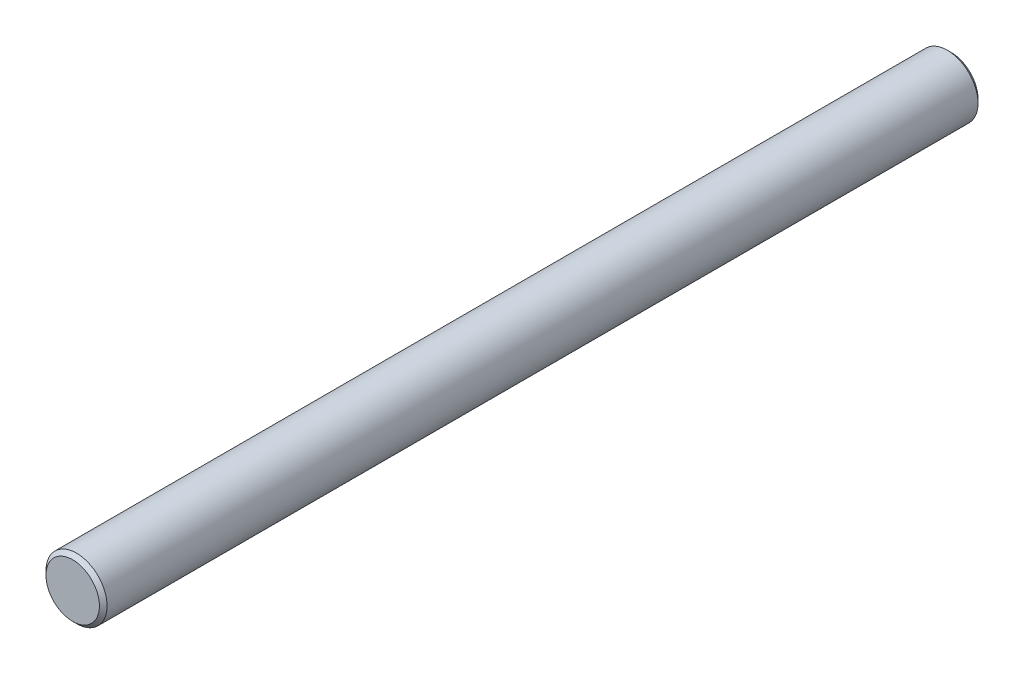
ISO-10303-21;
HEADER;
FILE_DESCRIPTION(('STEP AP214'),'2;1');
FILE_NAME('part.step','',(''),(''),'','','');
FILE_SCHEMA(('AUTOMOTIVE_DESIGN { 1 0 10303 214 1 1 1 1 }'));
ENDSEC;
DATA;
#1=APPLICATION_CONTEXT('core data for automotive mechanical design processes');
#2=APPLICATION_PROTOCOL_DEFINITION('international standard','automotive_design',2000,#1);
#3=PRODUCT_CONTEXT('',#1,'mechanical');
#4=PRODUCT('Part','Part','',(#3));
#5=PRODUCT_RELATED_PRODUCT_CATEGORY('part','',(#4));
#6=PRODUCT_DEFINITION_FORMATION('','',#4);
#7=PRODUCT_DEFINITION_CONTEXT('part definition',#1,'design');
#8=PRODUCT_DEFINITION('design','',#6,#7);
#9=PRODUCT_DEFINITION_SHAPE('','',#8);
#10=(LENGTH_UNIT() NAMED_UNIT(*) SI_UNIT(.MILLI.,.METRE.));
#11=(NAMED_UNIT(*) PLANE_ANGLE_UNIT() SI_UNIT($,.RADIAN.));
#12=(NAMED_UNIT(*) SI_UNIT($,.STERADIAN.) SOLID_ANGLE_UNIT());
#13=UNCERTAINTY_MEASURE_WITH_UNIT(LENGTH_MEASURE(1.E-05),#10,'distance_accuracy_value','');
#14=(GEOMETRIC_REPRESENTATION_CONTEXT(3) GLOBAL_UNCERTAINTY_ASSIGNED_CONTEXT((#13)) GLOBAL_UNIT_ASSIGNED_CONTEXT((#10,
#11,#12)) REPRESENTATION_CONTEXT('',''));
#15=CARTESIAN_POINT('',(0.,0.,0.));
#16=DIRECTION('',(0.,0.,1.));
#17=DIRECTION('',(1.,0.,0.));
#18=AXIS2_PLACEMENT_3D('',#15,#16,#17);
#19=CARTESIAN_POINT('',(0.,0.,57.5));
#20=DIRECTION('',(0.,0.,-1.));
#21=DIRECTION('',(-1.,0.,0.));
#22=AXIS2_PLACEMENT_3D('',#19,#20,#21);
#23=CYLINDRICAL_SURFACE('',#22,4.);
#24=CARTESIAN_POINT('',(0.,0.,-57.));
#25=DIRECTION('',(0.,0.,1.));
#26=DIRECTION('',(1.,0.,0.));
#27=AXIS2_PLACEMENT_3D('',#24,#25,#26);
#28=CIRCLE('',#27,4.);
#29=CARTESIAN_POINT('',(4.,0.,-57.));
#30=VERTEX_POINT('',#29);
#31=EDGE_CURVE('E51',#30,#30,#28,.T.);
#32=ORIENTED_EDGE('',*,*,#31,.T.);
#33=EDGE_LOOP('',(#32));
#34=FACE_BOUND('',#33,.T.);
#35=CARTESIAN_POINT('',(0.,0.,57.));
#36=DIRECTION('',(0.,0.,1.));
#37=DIRECTION('',(1.,0.,0.));
#38=AXIS2_PLACEMENT_3D('',#35,#36,#37);
#39=CIRCLE('',#38,4.);
#40=CARTESIAN_POINT('',(4.,0.,57.));
#41=VERTEX_POINT('',#40);
#42=EDGE_CURVE('E55',#41,#41,#39,.F.);
#43=ORIENTED_EDGE('',*,*,#42,.T.);
#44=EDGE_LOOP('',(#43));
#45=FACE_BOUND('',#44,.T.);
#46=ADVANCED_FACE('F39',(#34,#45),#23,.T.);
#47=CARTESIAN_POINT('',(0.,0.,57.5));
#48=DIRECTION('',(0.,0.,1.));
#49=DIRECTION('',(1.,0.,0.));
#50=AXIS2_PLACEMENT_3D('',#47,#48,#49);
#51=PLANE('',#50);
#52=CARTESIAN_POINT('',(0.,0.,57.5));
#53=DIRECTION('',(0.,0.,1.));
#54=DIRECTION('',(1.,0.,0.));
#55=AXIS2_PLACEMENT_3D('',#52,#53,#54);
#56=CIRCLE('',#55,3.50000000000002);
#57=CARTESIAN_POINT('',(3.50000000000002,0.,57.5));
#58=VERTEX_POINT('',#57);
#59=EDGE_CURVE('E10',#58,#58,#56,.T.);
#60=ORIENTED_EDGE('',*,*,#59,.T.);
#61=EDGE_LOOP('',(#60));
#62=FACE_BOUND('',#61,.T.);
#63=ADVANCED_FACE('F71',(#62),#51,.T.);
#64=CARTESIAN_POINT('',(0.,0.,-57.5));
#65=DIRECTION('',(0.,0.,1.));
#66=DIRECTION('',(1.,0.,0.));
#67=AXIS2_PLACEMENT_3D('',#64,#65,#66);
#68=PLANE('',#67);
#69=CARTESIAN_POINT('',(0.,0.,-57.5));
#70=DIRECTION('',(0.,0.,1.));
#71=DIRECTION('',(1.,0.,0.));
#72=AXIS2_PLACEMENT_3D('',#69,#70,#71);
#73=CIRCLE('',#72,3.49999999999999);
#74=CARTESIAN_POINT('',(3.49999999999999,0.,-57.5));
#75=VERTEX_POINT('',#74);
#76=EDGE_CURVE('E47',#75,#75,#73,.F.);
#77=ORIENTED_EDGE('',*,*,#76,.T.);
#78=EDGE_LOOP('',(#77));
#79=FACE_BOUND('',#78,.T.);
#80=ADVANCED_FACE('F68',(#79),#68,.F.);
#81=CARTESIAN_POINT('',(0.,0.,-57.));
#82=DIRECTION('',(0.,0.,1.));
#83=DIRECTION('',(1.,0.,0.));
#84=AXIS2_PLACEMENT_3D('',#81,#82,#83);
#85=CONICAL_SURFACE('',#84,4.,0.785398163397445);
#86=ORIENTED_EDGE('',*,*,#76,.F.);
#87=EDGE_LOOP('',(#86));
#88=FACE_BOUND('',#87,.T.);
#89=ORIENTED_EDGE('',*,*,#31,.F.);
#90=EDGE_LOOP('',(#89));
#91=FACE_BOUND('',#90,.T.);
#92=ADVANCED_FACE('F64',(#88,#91),#85,.T.);
#93=CARTESIAN_POINT('',(0.,0.,57.5));
#94=DIRECTION('',(0.,0.,-1.));
#95=DIRECTION('',(-1.,0.,0.));
#96=AXIS2_PLACEMENT_3D('',#93,#94,#95);
#97=CONICAL_SURFACE('',#96,3.50000000000002,0.785398163397452);
#98=ORIENTED_EDGE('',*,*,#42,.F.);
#99=EDGE_LOOP('',(#98));
#100=FACE_BOUND('',#99,.T.);
#101=ORIENTED_EDGE('',*,*,#59,.F.);
#102=EDGE_LOOP('',(#101));
#103=FACE_BOUND('',#102,.T.);
#104=ADVANCED_FACE('F42',(#100,#103),#97,.T.);
#105=CLOSED_SHELL('',(#46,#63,#80,#92,#104));
#106=MANIFOLD_SOLID_BREP('B2',#105);
#107=ADVANCED_BREP_SHAPE_REPRESENTATION('',(#18,#106),#14);
#108=SHAPE_DEFINITION_REPRESENTATION(#9,#107);
ENDSEC;
END-ISO-10303-21;
